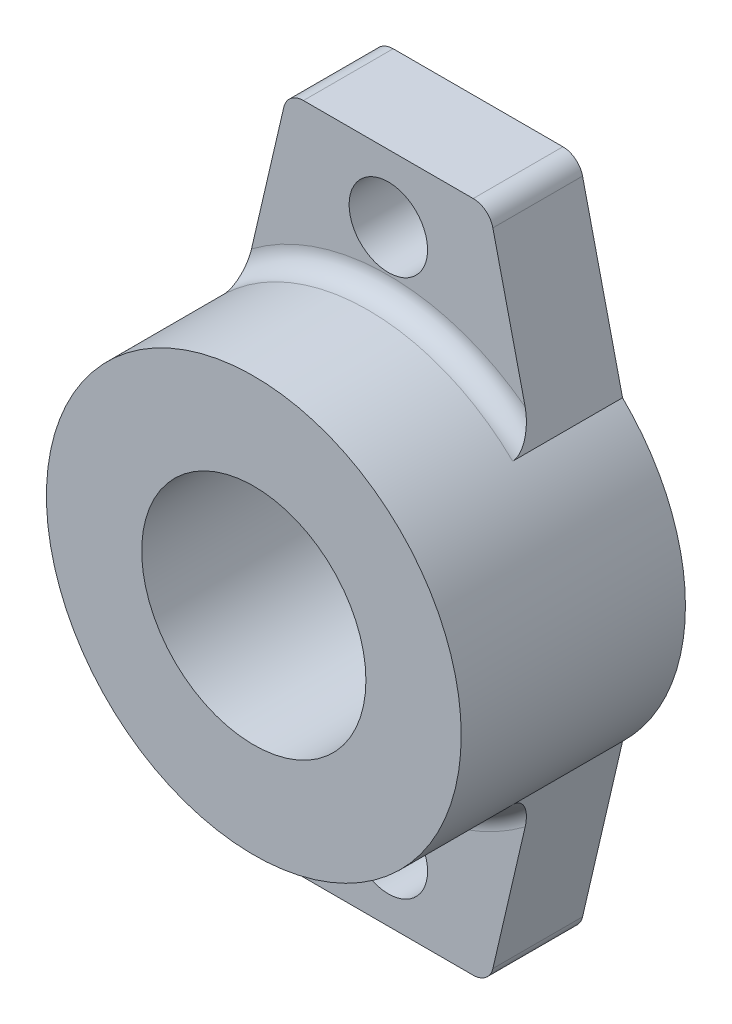
ISO-10303-21;
HEADER;
FILE_DESCRIPTION(('STEP AP214'),'2;1');
FILE_NAME('part.step','',(''),(''),'','','');
FILE_SCHEMA(('AUTOMOTIVE_DESIGN { 1 0 10303 214 1 1 1 1 }'));
ENDSEC;
DATA;
#1=APPLICATION_CONTEXT('core data for automotive mechanical design processes');
#2=APPLICATION_PROTOCOL_DEFINITION('international standard','automotive_design',2000,#1);
#3=PRODUCT_CONTEXT('',#1,'mechanical');
#4=PRODUCT('Part','Part','',(#3));
#5=PRODUCT_RELATED_PRODUCT_CATEGORY('part','',(#4));
#6=PRODUCT_DEFINITION_FORMATION('','',#4);
#7=PRODUCT_DEFINITION_CONTEXT('part definition',#1,'design');
#8=PRODUCT_DEFINITION('design','',#6,#7);
#9=PRODUCT_DEFINITION_SHAPE('','',#8);
#10=(LENGTH_UNIT() NAMED_UNIT(*) SI_UNIT(.MILLI.,.METRE.));
#11=(NAMED_UNIT(*) PLANE_ANGLE_UNIT() SI_UNIT($,.RADIAN.));
#12=(NAMED_UNIT(*) SI_UNIT($,.STERADIAN.) SOLID_ANGLE_UNIT());
#13=UNCERTAINTY_MEASURE_WITH_UNIT(LENGTH_MEASURE(1.E-05),#10,'distance_accuracy_value','');
#14=(GEOMETRIC_REPRESENTATION_CONTEXT(3) GLOBAL_UNCERTAINTY_ASSIGNED_CONTEXT((#13)) GLOBAL_UNIT_ASSIGNED_CONTEXT((#10,
#11,#12)) REPRESENTATION_CONTEXT('',''));
#15=CARTESIAN_POINT('',(0.,0.,0.));
#16=DIRECTION('',(0.,0.,1.));
#17=DIRECTION('',(1.,0.,0.));
#18=AXIS2_PLACEMENT_3D('',#15,#16,#17);
#19=CARTESIAN_POINT('',(0.,0.,1.8));
#20=DIRECTION('',(0.,0.,1.));
#21=DIRECTION('',(-0.00108773057764602,-0.99999940842092,0.));
#22=AXIS2_PLACEMENT_3D('',#19,#20,#21);
#23=TOROIDAL_SURFACE('',#22,20.3,1.8);
#24=CARTESIAN_POINT('',(0.,0.,1.8));
#25=DIRECTION('',(0.,0.,1.));
#26=DIRECTION('',(1.,0.,0.));
#27=AXIS2_PLACEMENT_3D('',#24,#25,#26);
#28=CIRCLE('',#27,18.5);
#29=CARTESIAN_POINT('',(12.8908446844407,13.2693678568961,1.8));
#30=VERTEX_POINT('',#29);
#31=CARTESIAN_POINT('',(-12.8908446844436,13.2693678568933,1.8));
#32=VERTEX_POINT('',#31);
#33=EDGE_CURVE('E258',#30,#32,#28,.T.);
#34=ORIENTED_EDGE('',*,*,#33,.F.);
#35=CARTESIAN_POINT('',(12.2042333189866,16.2217967283392,0.));
#36=CARTESIAN_POINT('',(12.2232682184367,16.139946660704,9.11961296261502E-06));
#37=CARTESIAN_POINT('',(12.2423017843978,16.0581023270711,0.00242689478153281));
#38=CARTESIAN_POINT('',(12.2803269468643,15.8945941284652,0.0119838013190764));
#39=CARTESIAN_POINT('',(12.2993184837802,15.812930519727,0.0191275679718214));
#40=CARTESIAN_POINT('',(12.3371917858918,15.6500753206471,0.0380446501428538));
#41=CARTESIAN_POINT('',(12.3560734937822,15.5688839767184,0.0498201948371002));
#42=CARTESIAN_POINT('',(12.3938557355289,15.4064203372075,0.0781132667526782));
#43=CARTESIAN_POINT('',(12.4127544301867,15.3251559501791,0.0946787495803135));
#44=CARTESIAN_POINT('',(12.4503020778258,15.1637010653311,0.132517470190925));
#45=CARTESIAN_POINT('',(12.4689511136081,15.0835102114672,0.153789103957675));
#46=CARTESIAN_POINT('',(12.5059262640607,14.9245170645208,0.201125705509117));
#47=CARTESIAN_POINT('',(12.5242525261195,14.8457141376679,0.22718841990267));
#48=CARTESIAN_POINT('',(12.5588442801138,14.6969695954925,0.281673166597617));
#49=CARTESIAN_POINT('',(12.5751448334197,14.6268772162773,0.309660748269941));
#50=CARTESIAN_POINT('',(12.6073318632189,14.4884729881406,0.369938382827424));
#51=CARTESIAN_POINT('',(12.6232183964901,14.4201608950743,0.402227842010163));
#52=CARTESIAN_POINT('',(12.654434749978,14.2859305750766,0.471304704683222));
#53=CARTESIAN_POINT('',(12.6697658751882,14.2200067366727,0.508080539327092));
#54=CARTESIAN_POINT('',(12.6997634366419,14.0910172224216,0.586548800367875));
#55=CARTESIAN_POINT('',(12.714430123929,14.0279504670873,0.628239348034514));
#56=CARTESIAN_POINT('',(12.7471293295133,13.8873438830746,0.73016456807406));
#57=CARTESIAN_POINT('',(12.7648732941983,13.8110448349292,0.792235769541915));
#58=CARTESIAN_POINT('',(12.7982676466972,13.667449119184,0.926688539412704));
#59=CARTESIAN_POINT('',(12.8139200264611,13.6001438861991,0.999060160411038));
#60=CARTESIAN_POINT('',(12.8378590450336,13.4972061063374,1.13191597999525));
#61=CARTESIAN_POINT('',(12.8469525795142,13.4581039080711,1.1895461319751));
#62=CARTESIAN_POINT('',(12.862991358577,13.389137158101,1.3102380453768));
#63=CARTESIAN_POINT('',(12.8699453509516,13.35923499089,1.37327630443697));
#64=CARTESIAN_POINT('',(12.8779744475904,13.3247098753434,1.46721917134583));
#65=CARTESIAN_POINT('',(12.8801593650168,13.3153147304099,1.49631780425599));
#66=CARTESIAN_POINT('',(12.8839528936835,13.299002557143,1.55523912964226));
#67=CARTESIAN_POINT('',(12.8855616820268,13.2920847672668,1.58506159659546));
#68=CARTESIAN_POINT('',(12.8881747682006,13.2808484967193,1.64557334191321));
#69=CARTESIAN_POINT('',(12.8891719714603,13.2765605227027,1.67626862453672));
#70=CARTESIAN_POINT('',(12.8905089734045,13.2708114143427,1.73797289475825));
#71=CARTESIAN_POINT('',(12.8908479808622,13.2693536822744,1.76898221493031));
#72=CARTESIAN_POINT('',(12.890844684438,13.2693678568987,1.8));
#73=B_SPLINE_CURVE_WITH_KNOTS('',3,(#35,#36,#37,#38,#39,#40,#41,#42,#43,#44,#45,#46,#47,#48,#49,
#50,#51,#52,#53,#54,#55,#56,#57,#58,#59,#60,#61,#62,#63,#64,#65,#66,#67,#68,#69,#70,#71,#72),
.UNSPECIFIED.,.F.,.F.,(4,2,2,2,2,2,2,2,2,2,2,2,2,2,2,2,2,2,4),(0.,0.252060173238066,
0.504367936020207,0.756797278017636,1.01184698120423,1.26680988833586,1.52165318403949,
1.75316511235686,1.98464512273035,2.21554036441121,2.44634762704796,2.74546529179767,
3.04429602593001,3.25436651161021,3.46356631927681,3.5554403346194,3.64728608345549,
3.74017805742669,3.83318162921873),.UNSPECIFIED.);
#74=CARTESIAN_POINT('',(12.2042333189887,16.2217967283397,0.));
#75=VERTEX_POINT('',#74);
#76=EDGE_CURVE('E292',#75,#30,#73,.T.);
#77=ORIENTED_EDGE('',*,*,#76,.F.);
#78=CARTESIAN_POINT('',(0.,0.,0.));
#79=DIRECTION('',(0.,0.,1.));
#80=DIRECTION('',(0.60119375955621,0.799103287110415,0.));
#81=AXIS2_PLACEMENT_3D('',#78,#79,#80);
#82=CIRCLE('',#81,20.2999999999982);
#83=CARTESIAN_POINT('',(-12.2042333189904,16.2217967283401,0.));
#84=VERTEX_POINT('',#83);
#85=EDGE_CURVE('E176',#84,#75,#82,.F.);
#86=ORIENTED_EDGE('',*,*,#85,.F.);
#87=CARTESIAN_POINT('',(-12.8908446844438,13.269367856893,1.8));
#88=CARTESIAN_POINT('',(-12.8908473650133,13.2693563304442,1.77055724650354));
#89=CARTESIAN_POINT('',(-12.8905421828495,13.2706686137488,1.74112119122909));
#90=CARTESIAN_POINT('',(-12.889336919027,13.2758512481855,1.68251755967709));
#91=CARTESIAN_POINT('',(-12.8884374622074,13.2797189125095,1.65334973399909));
#92=CARTESIAN_POINT('',(-12.8860768062903,13.2898697329531,1.59577756954812));
#93=CARTESIAN_POINT('',(-12.8846215813584,13.2961272001602,1.56736843601897));
#94=CARTESIAN_POINT('',(-12.881184980887,13.3109045821876,1.51117778958981));
#95=CARTESIAN_POINT('',(-12.8792034414771,13.3194252016501,1.48339647509223));
#96=CARTESIAN_POINT('',(-12.8714639649064,13.3527049509041,1.38811186766664));
#97=CARTESIAN_POINT('',(-12.8644508433793,13.3828613734707,1.32254025506602));
#98=CARTESIAN_POINT('',(-12.8481116134284,13.4531200622595,1.197131328713));
#99=CARTESIAN_POINT('',(-12.8387751942596,13.4932666646854,1.13732127174763));
#100=CARTESIAN_POINT('',(-12.812967309783,13.6042405679347,0.993303673886252));
#101=CARTESIAN_POINT('',(-12.7953486251054,13.6800009120485,0.913130856053849));
#102=CARTESIAN_POINT('',(-12.7576108952042,13.8422731506236,0.765376808899514));
#103=CARTESIAN_POINT('',(-12.7374867751858,13.9288068667027,0.697821852184106));
#104=CARTESIAN_POINT('',(-12.6987803539259,14.0952444781203,0.583143803727191));
#105=CARTESIAN_POINT('',(-12.6804289158382,14.1741556618973,0.534475864697016));
#106=CARTESIAN_POINT('',(-12.6428439990388,14.3357708041346,0.444223427244978));
#107=CARTESIAN_POINT('',(-12.6236099361613,14.4184772745077,0.40264370855227));
#108=CARTESIAN_POINT('',(-12.5844460800716,14.5868818556937,0.325945108489204));
#109=CARTESIAN_POINT('',(-12.5645148501995,14.6725861441438,0.290840632922034));
#110=CARTESIAN_POINT('',(-12.5241485316273,14.8461613140038,0.226810517380867));
#111=CARTESIAN_POINT('',(-12.503713355718,14.934032570414,0.197885955348159));
#112=CARTESIAN_POINT('',(-12.4603419406794,15.12052965508,0.143316985256996));
#113=CARTESIAN_POINT('',(-12.4373643079811,15.2193334756827,0.118314143533851));
#114=CARTESIAN_POINT('',(-12.3910707178822,15.4183959131079,0.0753907168346387));
#115=CARTESIAN_POINT('',(-12.36775472009,15.5186547036144,0.0574709847203253));
#116=CARTESIAN_POINT('',(-12.3211231318946,15.7191705328546,0.0288547973592498));
#117=CARTESIAN_POINT('',(-12.2978096678294,15.8194184283348,0.0180909361538147));
#118=CARTESIAN_POINT('',(-12.2510760833725,16.0203728414994,0.00367492853575505));
#119=CARTESIAN_POINT('',(-12.2276559896016,16.1210792447145,2.10952171475398E-05));
#120=CARTESIAN_POINT('',(-12.2042333189909,16.2217967283402,0.));
#121=B_SPLINE_CURVE_WITH_KNOTS('',3,(#87,#88,#89,#90,#91,#92,#93,#94,#95,#96,#97,#98,#99,#100,
#101,#102,#103,#104,#105,#106,#107,#108,#109,#110,#111,#112,#113,#114,#115,#116,#117,#118,#119,
#120),.UNSPECIFIED.,.F.,.F.,(4,2,2,2,2,2,2,2,2,2,2,2,2,2,2,2,4),(0.,0.0882865522680601,
0.176480424688227,0.263751799769501,0.351050379086609,0.567279268013555,0.784485446651958,
1.11772253115301,1.45164592191043,1.73479311793806,2.01813049696852,2.30209082226262,
2.58610063742702,2.89926651766176,3.21247009403775,3.52267993671267,3.83281617086143),.UNSPECIFIED.);
#122=EDGE_CURVE('E276',#32,#84,#121,.T.);
#123=ORIENTED_EDGE('',*,*,#122,.F.);
#124=EDGE_LOOP('',(#34,#77,#86,#123));
#125=FACE_BOUND('',#124,.T.);
#126=ADVANCED_FACE('F17',(#125),#23,.F.);
#127=CARTESIAN_POINT('',(0.,0.,1.8));
#128=DIRECTION('',(0.,0.,1.));
#129=DIRECTION('',(0.00108773057764602,0.99999940842092,0.));
#130=AXIS2_PLACEMENT_3D('',#127,#128,#129);
#131=TOROIDAL_SURFACE('',#130,20.3,1.8);
#132=CARTESIAN_POINT('',(0.,0.,1.8));
#133=DIRECTION('',(0.,0.,1.));
#134=DIRECTION('',(1.,0.,0.));
#135=AXIS2_PLACEMENT_3D('',#132,#133,#134);
#136=CIRCLE('',#135,18.5);
#137=CARTESIAN_POINT('',(-12.890844684439,-13.2693678568944,1.8));
#138=VERTEX_POINT('',#137);
#139=CARTESIAN_POINT('',(12.8908446844441,-13.269367856892,1.8));
#140=VERTEX_POINT('',#139);
#141=EDGE_CURVE('E168',#138,#140,#136,.T.);
#142=ORIENTED_EDGE('',*,*,#141,.F.);
#143=CARTESIAN_POINT('',(-12.2042333189866,-16.2217967283392,0.));
#144=CARTESIAN_POINT('',(-12.2232682184367,-16.139946660704,9.11961296261502E-06));
#145=CARTESIAN_POINT('',(-12.2423017843978,-16.0581023270711,0.00242689478153281));
#146=CARTESIAN_POINT('',(-12.2803269468643,-15.8945941284652,0.0119838013190764));
#147=CARTESIAN_POINT('',(-12.2993184837802,-15.812930519727,0.0191275679718214));
#148=CARTESIAN_POINT('',(-12.3371917858918,-15.6500753206471,0.0380446501428538));
#149=CARTESIAN_POINT('',(-12.3560734937822,-15.5688839767184,0.0498201948371002));
#150=CARTESIAN_POINT('',(-12.3938557355289,-15.4064203372075,0.0781132667526782));
#151=CARTESIAN_POINT('',(-12.4127544301867,-15.3251559501791,0.0946787495803135));
#152=CARTESIAN_POINT('',(-12.4503020778258,-15.1637010653311,0.132517470190925));
#153=CARTESIAN_POINT('',(-12.4689511136081,-15.0835102114672,0.153789103957675));
#154=CARTESIAN_POINT('',(-12.5059262640607,-14.9245170645208,0.201125705509117));
#155=CARTESIAN_POINT('',(-12.5242525261195,-14.8457141376679,0.22718841990267));
#156=CARTESIAN_POINT('',(-12.5588442801138,-14.6969695954925,0.281673166597617));
#157=CARTESIAN_POINT('',(-12.5751448334197,-14.6268772162773,0.309660748269941));
#158=CARTESIAN_POINT('',(-12.6073318632189,-14.4884729881406,0.369938382827424));
#159=CARTESIAN_POINT('',(-12.6232183964901,-14.4201608950743,0.402227842010163));
#160=CARTESIAN_POINT('',(-12.654434749978,-14.2859305750766,0.471304704683222));
#161=CARTESIAN_POINT('',(-12.6697658751882,-14.2200067366727,0.508080539327092));
#162=CARTESIAN_POINT('',(-12.6997634366419,-14.0910172224216,0.586548800367875));
#163=CARTESIAN_POINT('',(-12.714430123929,-14.0279504670873,0.628239348034514));
#164=CARTESIAN_POINT('',(-12.7471293295133,-13.8873438830746,0.73016456807406));
#165=CARTESIAN_POINT('',(-12.7648732941983,-13.8110448349292,0.792235769541915));
#166=CARTESIAN_POINT('',(-12.7982676466972,-13.667449119184,0.926688539412704));
#167=CARTESIAN_POINT('',(-12.8139200264611,-13.6001438861991,0.999060160411038));
#168=CARTESIAN_POINT('',(-12.8378590450336,-13.4972061063374,1.13191597999525));
#169=CARTESIAN_POINT('',(-12.8469525795142,-13.4581039080711,1.1895461319751));
#170=CARTESIAN_POINT('',(-12.862991358577,-13.389137158101,1.3102380453768));
#171=CARTESIAN_POINT('',(-12.8699453509516,-13.35923499089,1.37327630443697));
#172=CARTESIAN_POINT('',(-12.8779744475904,-13.3247098753434,1.46721917134583));
#173=CARTESIAN_POINT('',(-12.8801593650168,-13.3153147304099,1.49631780425599));
#174=CARTESIAN_POINT('',(-12.8839528936835,-13.299002557143,1.55523912964226));
#175=CARTESIAN_POINT('',(-12.8855616820268,-13.2920847672668,1.58506159659546));
#176=CARTESIAN_POINT('',(-12.8881747682006,-13.2808484967193,1.64557334191321));
#177=CARTESIAN_POINT('',(-12.8891719714603,-13.2765605227027,1.67626862453672));
#178=CARTESIAN_POINT('',(-12.8905089734045,-13.2708114143427,1.73797289475825));
#179=CARTESIAN_POINT('',(-12.8908479808622,-13.2693536822744,1.76898221493031));
#180=CARTESIAN_POINT('',(-12.890844684438,-13.2693678568987,1.8));
#181=B_SPLINE_CURVE_WITH_KNOTS('',3,(#143,#144,#145,#146,#147,#148,#149,#150,#151,#152,#153,
#154,#155,#156,#157,#158,#159,#160,#161,#162,#163,#164,#165,#166,#167,#168,#169,#170,#171,#172,
#173,#174,#175,#176,#177,#178,#179,#180),.UNSPECIFIED.,.F.,.F.,(4,2,2,2,2,2,2,2,2,2,2,2,2,2,2,2,
2,2,4),(0.,0.252060173238066,0.504367936020207,0.756797278017636,1.01184698120423,
1.26680988833586,1.52165318403949,1.75316511235686,1.98464512273035,2.21554036441121,
2.44634762704796,2.74546529179767,3.04429602593001,3.25436651161021,3.46356631927681,
3.5554403346194,3.64728608345549,3.74017805742669,3.83318162921873),.UNSPECIFIED.);
#182=CARTESIAN_POINT('',(-12.2042333189887,-16.2217967283397,0.));
#183=VERTEX_POINT('',#182);
#184=EDGE_CURVE('E254',#183,#138,#181,.T.);
#185=ORIENTED_EDGE('',*,*,#184,.F.);
#186=CARTESIAN_POINT('',(0.,0.,0.));
#187=DIRECTION('',(0.,0.,1.));
#188=DIRECTION('',(-0.60119375955621,-0.799103287110415,0.));
#189=AXIS2_PLACEMENT_3D('',#186,#187,#188);
#190=CIRCLE('',#189,20.2999999999982);
#191=CARTESIAN_POINT('',(12.2042333189904,-16.2217967283401,0.));
#192=VERTEX_POINT('',#191);
#193=EDGE_CURVE('E130',#192,#183,#190,.F.);
#194=ORIENTED_EDGE('',*,*,#193,.F.);
#195=CARTESIAN_POINT('',(12.8908446844438,-13.269367856893,1.8));
#196=CARTESIAN_POINT('',(12.8908473650133,-13.2693563304442,1.77055724650354));
#197=CARTESIAN_POINT('',(12.8905421828495,-13.2706686137488,1.74112119122909));
#198=CARTESIAN_POINT('',(12.889336919027,-13.2758512481855,1.68251755967709));
#199=CARTESIAN_POINT('',(12.8884374622074,-13.2797189125095,1.65334973399909));
#200=CARTESIAN_POINT('',(12.8860768062903,-13.2898697329531,1.59577756954812));
#201=CARTESIAN_POINT('',(12.8846215813584,-13.2961272001602,1.56736843601897));
#202=CARTESIAN_POINT('',(12.881184980887,-13.3109045821876,1.51117778958981));
#203=CARTESIAN_POINT('',(12.8792034414771,-13.3194252016501,1.48339647509223));
#204=CARTESIAN_POINT('',(12.8714639649064,-13.3527049509041,1.38811186766664));
#205=CARTESIAN_POINT('',(12.8644508433793,-13.3828613734707,1.32254025506602));
#206=CARTESIAN_POINT('',(12.8481116134284,-13.4531200622595,1.197131328713));
#207=CARTESIAN_POINT('',(12.8387751942596,-13.4932666646854,1.13732127174763));
#208=CARTESIAN_POINT('',(12.812967309783,-13.6042405679347,0.993303673886252));
#209=CARTESIAN_POINT('',(12.7953486251054,-13.6800009120485,0.913130856053849));
#210=CARTESIAN_POINT('',(12.7576108952042,-13.8422731506236,0.765376808899514));
#211=CARTESIAN_POINT('',(12.7374867751858,-13.9288068667027,0.697821852184106));
#212=CARTESIAN_POINT('',(12.6987803539259,-14.0952444781203,0.583143803727191));
#213=CARTESIAN_POINT('',(12.6804289158382,-14.1741556618973,0.534475864697016));
#214=CARTESIAN_POINT('',(12.6428439990388,-14.3357708041346,0.444223427244978));
#215=CARTESIAN_POINT('',(12.6236099361613,-14.4184772745077,0.40264370855227));
#216=CARTESIAN_POINT('',(12.5844460800716,-14.5868818556937,0.325945108489204));
#217=CARTESIAN_POINT('',(12.5645148501995,-14.6725861441438,0.290840632922034));
#218=CARTESIAN_POINT('',(12.5241485316273,-14.8461613140038,0.226810517380867));
#219=CARTESIAN_POINT('',(12.503713355718,-14.934032570414,0.197885955348159));
#220=CARTESIAN_POINT('',(12.4603419406794,-15.12052965508,0.143316985256996));
#221=CARTESIAN_POINT('',(12.4373643079811,-15.2193334756827,0.118314143533851));
#222=CARTESIAN_POINT('',(12.3910707178822,-15.4183959131079,0.0753907168346387));
#223=CARTESIAN_POINT('',(12.36775472009,-15.5186547036144,0.0574709847203253));
#224=CARTESIAN_POINT('',(12.3211231318946,-15.7191705328546,0.0288547973592498));
#225=CARTESIAN_POINT('',(12.2978096678294,-15.8194184283348,0.0180909361538147));
#226=CARTESIAN_POINT('',(12.2510760833725,-16.0203728414994,0.00367492853575505));
#227=CARTESIAN_POINT('',(12.2276559896016,-16.1210792447145,2.10952171475398E-05));
#228=CARTESIAN_POINT('',(12.2042333189909,-16.2217967283402,0.));
#229=B_SPLINE_CURVE_WITH_KNOTS('',3,(#195,#196,#197,#198,#199,#200,#201,#202,#203,#204,#205,
#206,#207,#208,#209,#210,#211,#212,#213,#214,#215,#216,#217,#218,#219,#220,#221,#222,#223,#224,
#225,#226,#227,#228),.UNSPECIFIED.,.F.,.F.,(4,2,2,2,2,2,2,2,2,2,2,2,2,2,2,2,4),(0.,
0.0882865522680601,0.176480424688227,0.263751799769501,0.351050379086609,0.567279268013555,
0.784485446651958,1.11772253115301,1.45164592191043,1.73479311793806,2.01813049696852,
2.30209082226262,2.58610063742702,2.89926651766176,3.21247009403775,3.52267993671267,
3.83281617086143),.UNSPECIFIED.);
#230=EDGE_CURVE('E304',#140,#192,#229,.T.);
#231=ORIENTED_EDGE('',*,*,#230,.F.);
#232=EDGE_LOOP('',(#142,#185,#194,#231));
#233=FACE_BOUND('',#232,.T.);
#234=ADVANCED_FACE('F180',(#233),#131,.F.);
#235=CARTESIAN_POINT('',(0.,0.,12.));
#236=DIRECTION('',(0.,0.,1.));
#237=DIRECTION('',(1.,0.,0.));
#238=AXIS2_PLACEMENT_3D('',#235,#236,#237);
#239=PLANE('',#238);
#240=CARTESIAN_POINT('',(0.,0.,12.));
#241=DIRECTION('',(0.,0.,1.));
#242=DIRECTION('',(1.,0.,0.));
#243=AXIS2_PLACEMENT_3D('',#240,#241,#242);
#244=CIRCLE('',#243,10.);
#245=CARTESIAN_POINT('',(10.,0.,12.));
#246=VERTEX_POINT('',#245);
#247=EDGE_CURVE('E251',#246,#246,#244,.F.);
#248=ORIENTED_EDGE('',*,*,#247,.T.);
#249=EDGE_LOOP('',(#248));
#250=FACE_BOUND('',#249,.T.);
#251=CARTESIAN_POINT('',(0.,0.,12.));
#252=DIRECTION('',(0.,0.,1.));
#253=DIRECTION('',(1.,0.,0.));
#254=AXIS2_PLACEMENT_3D('',#251,#252,#253);
#255=CIRCLE('',#254,18.5);
#256=CARTESIAN_POINT('',(18.5,0.,12.));
#257=VERTEX_POINT('',#256);
#258=EDGE_CURVE('E272',#257,#257,#255,.F.);
#259=ORIENTED_EDGE('',*,*,#258,.F.);
#260=EDGE_LOOP('',(#259));
#261=FACE_BOUND('',#260,.T.);
#262=ADVANCED_FACE('F163',(#250,#261),#239,.T.);
#263=CARTESIAN_POINT('',(0.,0.,0.));
#264=DIRECTION('',(0.,0.,1.));
#265=DIRECTION('',(1.,0.,0.));
#266=AXIS2_PLACEMENT_3D('',#263,#264,#265);
#267=PLANE('',#266);
#268=CARTESIAN_POINT('',(0.,24.,0.));
#269=DIRECTION('',(0.,0.,-1.));
#270=DIRECTION('',(-1.,0.,0.));
#271=AXIS2_PLACEMENT_3D('',#268,#269,#270);
#272=CIRCLE('',#271,3.5);
#273=CARTESIAN_POINT('',(-3.5,24.,0.));
#274=VERTEX_POINT('',#273);
#275=EDGE_CURVE('E248',#274,#274,#272,.T.);
#276=ORIENTED_EDGE('',*,*,#275,.T.);
#277=EDGE_LOOP('',(#276));
#278=FACE_BOUND('',#277,.T.);
#279=DIRECTION('',(1.,0.,0.));
#280=VECTOR('',#279,1.);
#281=CARTESIAN_POINT('',(9.,30.,0.));
#282=LINE('',#281,#280);
#283=CARTESIAN_POINT('',(-7.570570600076,30.,0.));
#284=VERTEX_POINT('',#283);
#285=CARTESIAN_POINT('',(7.570570600076,30.,0.));
#286=VERTEX_POINT('',#285);
#287=EDGE_CURVE('E285',#284,#286,#282,.T.);
#288=ORIENTED_EDGE('',*,*,#287,.F.);
#289=CARTESIAN_POINT('',(-7.570570600076,28.2,0.));
#290=DIRECTION('',(0.,0.,-1.));
#291=DIRECTION('',(-1.,0.,0.));
#292=AXIS2_PLACEMENT_3D('',#289,#290,#291);
#293=CIRCLE('',#292,1.8);
#294=CARTESIAN_POINT('',(-9.32378504874672,28.6077242903893,0.));
#295=VERTEX_POINT('',#294);
#296=EDGE_CURVE('E282',#295,#284,#293,.T.);
#297=ORIENTED_EDGE('',*,*,#296,.F.);
#298=DIRECTION('',(-0.226513494660298,-0.974008027039192,0.));
#299=VECTOR('',#298,1.);
#300=CARTESIAN_POINT('',(-9.,30.,0.));
#301=LINE('',#300,#299);
#302=EDGE_CURVE('E274',#84,#295,#301,.F.);
#303=ORIENTED_EDGE('',*,*,#302,.F.);
#304=ORIENTED_EDGE('',*,*,#85,.T.);
#305=DIRECTION('',(-0.226513494660298,0.974008027039192,0.));
#306=VECTOR('',#305,1.);
#307=CARTESIAN_POINT('',(12.89084468444,13.26936785689,0.));
#308=LINE('',#307,#306);
#309=CARTESIAN_POINT('',(9.3237850487444,28.6077242903887,0.));
#310=VERTEX_POINT('',#309);
#311=EDGE_CURVE('E289',#310,#75,#308,.F.);
#312=ORIENTED_EDGE('',*,*,#311,.F.);
#313=CARTESIAN_POINT('',(7.570570600076,28.2,0.));
#314=DIRECTION('',(0.,0.,-1.));
#315=DIRECTION('',(-1.,0.,0.));
#316=AXIS2_PLACEMENT_3D('',#313,#314,#315);
#317=CIRCLE('',#316,1.8);
#318=EDGE_CURVE('E288',#286,#310,#317,.T.);
#319=ORIENTED_EDGE('',*,*,#318,.F.);
#320=EDGE_LOOP('',(#288,#297,#303,#304,#312,#319));
#321=FACE_BOUND('',#320,.T.);
#322=ADVANCED_FACE('F157',(#278,#321),#267,.T.);
#323=CARTESIAN_POINT('',(0.,0.,0.));
#324=DIRECTION('',(0.,0.,1.));
#325=DIRECTION('',(1.,0.,0.));
#326=AXIS2_PLACEMENT_3D('',#323,#324,#325);
#327=PLANE('',#326);
#328=CARTESIAN_POINT('',(0.,-24.,0.));
#329=DIRECTION('',(0.,0.,1.));
#330=DIRECTION('',(1.,0.,0.));
#331=AXIS2_PLACEMENT_3D('',#328,#329,#330);
#332=CIRCLE('',#331,3.5);
#333=CARTESIAN_POINT('',(3.5,-24.,0.));
#334=VERTEX_POINT('',#333);
#335=EDGE_CURVE('E245',#334,#334,#332,.F.);
#336=ORIENTED_EDGE('',*,*,#335,.T.);
#337=EDGE_LOOP('',(#336));
#338=FACE_BOUND('',#337,.T.);
#339=DIRECTION('',(0.226513494660298,-0.974008027039192,0.));
#340=VECTOR('',#339,1.);
#341=CARTESIAN_POINT('',(-12.89084468444,-13.26936785689,0.));
#342=LINE('',#341,#340);
#343=CARTESIAN_POINT('',(-9.3237850487424,-28.6077242903883,0.));
#344=VERTEX_POINT('',#343);
#345=EDGE_CURVE('E126',#344,#183,#342,.F.);
#346=ORIENTED_EDGE('',*,*,#345,.F.);
#347=CARTESIAN_POINT('',(-7.570570600076,-28.2,0.));
#348=DIRECTION('',(0.,0.,-1.));
#349=DIRECTION('',(-1.,0.,0.));
#350=AXIS2_PLACEMENT_3D('',#347,#348,#349);
#351=CIRCLE('',#350,1.8);
#352=CARTESIAN_POINT('',(-7.570570600076,-30.,0.));
#353=VERTEX_POINT('',#352);
#354=EDGE_CURVE('E22',#353,#344,#351,.T.);
#355=ORIENTED_EDGE('',*,*,#354,.F.);
#356=DIRECTION('',(1.,0.,0.));
#357=VECTOR('',#356,1.);
#358=CARTESIAN_POINT('',(-9.,-30.,0.));
#359=LINE('',#358,#357);
#360=CARTESIAN_POINT('',(7.570570600076,-30.,0.));
#361=VERTEX_POINT('',#360);
#362=EDGE_CURVE('E110',#361,#353,#359,.F.);
#363=ORIENTED_EDGE('',*,*,#362,.F.);
#364=CARTESIAN_POINT('',(7.570570600076,-28.2,0.));
#365=DIRECTION('',(0.,0.,-1.));
#366=DIRECTION('',(-1.,0.,0.));
#367=AXIS2_PLACEMENT_3D('',#364,#365,#366);
#368=CIRCLE('',#367,1.8);
#369=CARTESIAN_POINT('',(9.32378504874672,-28.6077242903893,0.));
#370=VERTEX_POINT('',#369);
#371=EDGE_CURVE('E134',#370,#361,#368,.T.);
#372=ORIENTED_EDGE('',*,*,#371,.F.);
#373=DIRECTION('',(0.226513494660298,0.974008027039192,0.));
#374=VECTOR('',#373,1.);
#375=CARTESIAN_POINT('',(9.,-30.,0.));
#376=LINE('',#375,#374);
#377=EDGE_CURVE('E302',#192,#370,#376,.F.);
#378=ORIENTED_EDGE('',*,*,#377,.F.);
#379=ORIENTED_EDGE('',*,*,#193,.T.);
#380=EDGE_LOOP('',(#346,#355,#363,#372,#378,#379));
#381=FACE_BOUND('',#380,.T.);
#382=ADVANCED_FACE('F123',(#338,#381),#327,.T.);
#383=CARTESIAN_POINT('',(-7.570570600076,-28.2,38.072));
#384=DIRECTION('',(0.,0.,-1.));
#385=DIRECTION('',(-1.,0.,0.));
#386=AXIS2_PLACEMENT_3D('',#383,#384,#385);
#387=CYLINDRICAL_SURFACE('',#386,1.8);
#388=DIRECTION('',(0.,0.,1.));
#389=VECTOR('',#388,1.);
#390=CARTESIAN_POINT('',(-9.32378504874225,-28.6077242903889,0.));
#391=LINE('',#390,#389);
#392=CARTESIAN_POINT('',(-9.32378504874484,-28.6077242903885,-8.));
#393=VERTEX_POINT('',#392);
#394=EDGE_CURVE('E253',#393,#344,#391,.T.);
#395=ORIENTED_EDGE('',*,*,#394,.F.);
#396=CARTESIAN_POINT('',(-7.570570600076,-28.2,-8.));
#397=DIRECTION('',(0.,0.,-1.));
#398=DIRECTION('',(-1.,0.,0.));
#399=AXIS2_PLACEMENT_3D('',#396,#397,#398);
#400=CIRCLE('',#399,1.8);
#401=CARTESIAN_POINT('',(-7.570570600076,-30.,-8.));
#402=VERTEX_POINT('',#401);
#403=EDGE_CURVE('E133',#393,#402,#400,.F.);
#404=ORIENTED_EDGE('',*,*,#403,.T.);
#405=DIRECTION('',(0.,0.,-1.));
#406=VECTOR('',#405,1.);
#407=CARTESIAN_POINT('',(-7.570570600076,-30.,0.));
#408=LINE('',#407,#406);
#409=EDGE_CURVE('E115',#353,#402,#408,.T.);
#410=ORIENTED_EDGE('',*,*,#409,.F.);
#411=ORIENTED_EDGE('',*,*,#354,.T.);
#412=EDGE_LOOP('',(#395,#404,#410,#411));
#413=FACE_BOUND('',#412,.T.);
#414=ADVANCED_FACE('F132',(#413),#387,.T.);
#415=CARTESIAN_POINT('',(-9.,-30.,0.));
#416=DIRECTION('',(0.,-1.,0.));
#417=DIRECTION('',(0.,0.,-1.));
#418=AXIS2_PLACEMENT_3D('',#415,#416,#417);
#419=PLANE('',#418);
#420=ORIENTED_EDGE('',*,*,#362,.T.);
#421=ORIENTED_EDGE('',*,*,#409,.T.);
#422=DIRECTION('',(1.,0.,0.));
#423=VECTOR('',#422,1.);
#424=CARTESIAN_POINT('',(0.,-30.,-8.));
#425=LINE('',#424,#423);
#426=CARTESIAN_POINT('',(7.570570600076,-30.,-8.));
#427=VERTEX_POINT('',#426);
#428=EDGE_CURVE('E243',#402,#427,#425,.T.);
#429=ORIENTED_EDGE('',*,*,#428,.T.);
#430=DIRECTION('',(0.,0.,-1.));
#431=VECTOR('',#430,1.);
#432=CARTESIAN_POINT('',(7.570570600076,-30.,38.072));
#433=LINE('',#432,#431);
#434=EDGE_CURVE('E117',#361,#427,#433,.T.);
#435=ORIENTED_EDGE('',*,*,#434,.F.);
#436=EDGE_LOOP('',(#420,#421,#429,#435));
#437=FACE_BOUND('',#436,.T.);
#438=ADVANCED_FACE('F112',(#437),#419,.T.);
#439=CARTESIAN_POINT('',(7.570570600076,-28.2,38.072));
#440=DIRECTION('',(0.,0.,-1.));
#441=DIRECTION('',(-1.,0.,0.));
#442=AXIS2_PLACEMENT_3D('',#439,#440,#441);
#443=CYLINDRICAL_SURFACE('',#442,1.8);
#444=ORIENTED_EDGE('',*,*,#434,.T.);
#445=CARTESIAN_POINT('',(7.570570600076,-28.2,-8.));
#446=DIRECTION('',(0.,0.,-1.));
#447=DIRECTION('',(-1.,0.,0.));
#448=AXIS2_PLACEMENT_3D('',#445,#446,#447);
#449=CIRCLE('',#448,1.8);
#450=CARTESIAN_POINT('',(9.323785048747,-28.607724290389,-8.));
#451=VERTEX_POINT('',#450);
#452=EDGE_CURVE('E240',#427,#451,#449,.F.);
#453=ORIENTED_EDGE('',*,*,#452,.T.);
#454=DIRECTION('',(0.,0.,1.));
#455=VECTOR('',#454,1.);
#456=CARTESIAN_POINT('',(9.32378504874656,-28.6077242903899,0.));
#457=LINE('',#456,#455);
#458=EDGE_CURVE('E293',#370,#451,#457,.F.);
#459=ORIENTED_EDGE('',*,*,#458,.F.);
#460=ORIENTED_EDGE('',*,*,#371,.T.);
#461=EDGE_LOOP('',(#444,#453,#459,#460));
#462=FACE_BOUND('',#461,.T.);
#463=ADVANCED_FACE('F319',(#462),#443,.T.);
#464=CARTESIAN_POINT('',(9.,-30.,0.));
#465=DIRECTION('',(0.974008027039192,-0.226513494660298,0.));
#466=DIRECTION('',(0.226513494660298,0.974008027039192,0.));
#467=AXIS2_PLACEMENT_3D('',#464,#465,#466);
#468=PLANE('',#467);
#469=ORIENTED_EDGE('',*,*,#377,.T.);
#470=ORIENTED_EDGE('',*,*,#458,.T.);
#471=DIRECTION('',(0.226513494659997,0.974008027039262,0.));
#472=VECTOR('',#471,1.);
#473=CARTESIAN_POINT('',(9.323785048747,-28.60772429039,-8.));
#474=LINE('',#473,#472);
#475=CARTESIAN_POINT('',(12.8908446844407,-13.2693678568961,-8.));
#476=VERTEX_POINT('',#475);
#477=EDGE_CURVE('E239',#451,#476,#474,.T.);
#478=ORIENTED_EDGE('',*,*,#477,.T.);
#479=DIRECTION('',(0.,0.,1.));
#480=VECTOR('',#479,1.);
#481=CARTESIAN_POINT('',(12.8908446844434,-13.2693678568935,0.));
#482=LINE('',#481,#480);
#483=EDGE_CURVE('E296',#140,#476,#482,.F.);
#484=ORIENTED_EDGE('',*,*,#483,.F.);
#485=ORIENTED_EDGE('',*,*,#230,.T.);
#486=EDGE_LOOP('',(#469,#470,#478,#484,#485));
#487=FACE_BOUND('',#486,.T.);
#488=ADVANCED_FACE('F310',(#487),#468,.T.);
#489=CARTESIAN_POINT('',(12.89084468444,13.26936785689,0.));
#490=DIRECTION('',(0.974008027039192,0.226513494660298,0.));
#491=DIRECTION('',(-0.226513494660298,0.974008027039192,0.));
#492=AXIS2_PLACEMENT_3D('',#489,#490,#491);
#493=PLANE('',#492);
#494=DIRECTION('',(-0.226513494659997,0.974008027039262,0.));
#495=VECTOR('',#494,1.);
#496=CARTESIAN_POINT('',(12.89084468444,13.26936785689,-8.));
#497=LINE('',#496,#495);
#498=CARTESIAN_POINT('',(12.8908446844407,13.2693678568961,-8.));
#499=VERTEX_POINT('',#498);
#500=CARTESIAN_POINT('',(9.32378504874684,28.607724290389,-8.));
#501=VERTEX_POINT('',#500);
#502=EDGE_CURVE('E235',#499,#501,#497,.T.);
#503=ORIENTED_EDGE('',*,*,#502,.T.);
#504=DIRECTION('',(0.,0.,-1.));
#505=VECTOR('',#504,1.);
#506=CARTESIAN_POINT('',(9.32378504874625,28.6077242903898,38.072));
#507=LINE('',#506,#505);
#508=EDGE_CURVE('E286',#310,#501,#507,.T.);
#509=ORIENTED_EDGE('',*,*,#508,.F.);
#510=ORIENTED_EDGE('',*,*,#311,.T.);
#511=ORIENTED_EDGE('',*,*,#76,.T.);
#512=DIRECTION('',(0.,0.,1.));
#513=VECTOR('',#512,1.);
#514=CARTESIAN_POINT('',(12.8908446844434,13.2693678568935,0.));
#515=LINE('',#514,#513);
#516=EDGE_CURVE('E261',#499,#30,#515,.T.);
#517=ORIENTED_EDGE('',*,*,#516,.F.);
#518=EDGE_LOOP('',(#503,#509,#510,#511,#517));
#519=FACE_BOUND('',#518,.T.);
#520=ADVANCED_FACE('F337',(#519),#493,.T.);
#521=CARTESIAN_POINT('',(7.570570600076,28.2,38.072));
#522=DIRECTION('',(0.,0.,-1.));
#523=DIRECTION('',(-1.,0.,0.));
#524=AXIS2_PLACEMENT_3D('',#521,#522,#523);
#525=CYLINDRICAL_SURFACE('',#524,1.8);
#526=ORIENTED_EDGE('',*,*,#508,.T.);
#527=CARTESIAN_POINT('',(7.570570600076,28.2,-8.));
#528=DIRECTION('',(0.,0.,-1.));
#529=DIRECTION('',(-1.,0.,0.));
#530=AXIS2_PLACEMENT_3D('',#527,#528,#529);
#531=CIRCLE('',#530,1.8);
#532=CARTESIAN_POINT('',(7.570570600076,30.,-8.));
#533=VERTEX_POINT('',#532);
#534=EDGE_CURVE('E232',#501,#533,#531,.F.);
#535=ORIENTED_EDGE('',*,*,#534,.T.);
#536=DIRECTION('',(0.,0.,1.));
#537=VECTOR('',#536,1.);
#538=CARTESIAN_POINT('',(7.570570600076,30.,0.));
#539=LINE('',#538,#537);
#540=EDGE_CURVE('E283',#286,#533,#539,.F.);
#541=ORIENTED_EDGE('',*,*,#540,.F.);
#542=ORIENTED_EDGE('',*,*,#318,.T.);
#543=EDGE_LOOP('',(#526,#535,#541,#542));
#544=FACE_BOUND('',#543,.T.);
#545=ADVANCED_FACE('F418',(#544),#525,.T.);
#546=CARTESIAN_POINT('',(9.,30.,0.));
#547=DIRECTION('',(0.,1.,0.));
#548=DIRECTION('',(0.,0.,1.));
#549=AXIS2_PLACEMENT_3D('',#546,#547,#548);
#550=PLANE('',#549);
#551=DIRECTION('',(1.,0.,0.));
#552=VECTOR('',#551,1.);
#553=CARTESIAN_POINT('',(0.,30.,-8.));
#554=LINE('',#553,#552);
#555=CARTESIAN_POINT('',(-7.570570600076,30.,-8.));
#556=VERTEX_POINT('',#555);
#557=EDGE_CURVE('E231',#533,#556,#554,.F.);
#558=ORIENTED_EDGE('',*,*,#557,.T.);
#559=DIRECTION('',(0.,0.,-1.));
#560=VECTOR('',#559,1.);
#561=CARTESIAN_POINT('',(-7.570570600076,30.,38.072));
#562=LINE('',#561,#560);
#563=EDGE_CURVE('E280',#284,#556,#562,.T.);
#564=ORIENTED_EDGE('',*,*,#563,.F.);
#565=ORIENTED_EDGE('',*,*,#287,.T.);
#566=ORIENTED_EDGE('',*,*,#540,.T.);
#567=EDGE_LOOP('',(#558,#564,#565,#566));
#568=FACE_BOUND('',#567,.T.);
#569=ADVANCED_FACE('F420',(#568),#550,.T.);
#570=CARTESIAN_POINT('',(-7.570570600076,28.2,38.072));
#571=DIRECTION('',(0.,0.,-1.));
#572=DIRECTION('',(-1.,0.,0.));
#573=AXIS2_PLACEMENT_3D('',#570,#571,#572);
#574=CYLINDRICAL_SURFACE('',#573,1.8);
#575=ORIENTED_EDGE('',*,*,#563,.T.);
#576=CARTESIAN_POINT('',(-7.570570600076,28.2,-8.));
#577=DIRECTION('',(0.,0.,-1.));
#578=DIRECTION('',(-1.,0.,0.));
#579=AXIS2_PLACEMENT_3D('',#576,#577,#578);
#580=CIRCLE('',#579,1.8);
#581=CARTESIAN_POINT('',(-9.323785048747,28.607724290389,-8.));
#582=VERTEX_POINT('',#581);
#583=EDGE_CURVE('E228',#556,#582,#580,.F.);
#584=ORIENTED_EDGE('',*,*,#583,.T.);
#585=DIRECTION('',(0.,0.,1.));
#586=VECTOR('',#585,1.);
#587=CARTESIAN_POINT('',(-9.32378504874656,28.6077242903899,0.));
#588=LINE('',#587,#586);
#589=EDGE_CURVE('E273',#295,#582,#588,.F.);
#590=ORIENTED_EDGE('',*,*,#589,.F.);
#591=ORIENTED_EDGE('',*,*,#296,.T.);
#592=EDGE_LOOP('',(#575,#584,#590,#591));
#593=FACE_BOUND('',#592,.T.);
#594=ADVANCED_FACE('F377',(#593),#574,.T.);
#595=CARTESIAN_POINT('',(-9.,30.,0.));
#596=DIRECTION('',(-0.974008027039192,0.226513494660298,0.));
#597=DIRECTION('',(-0.226513494660298,-0.974008027039192,0.));
#598=AXIS2_PLACEMENT_3D('',#595,#596,#597);
#599=PLANE('',#598);
#600=ORIENTED_EDGE('',*,*,#302,.T.);
#601=ORIENTED_EDGE('',*,*,#589,.T.);
#602=DIRECTION('',(-0.226513494659997,-0.974008027039262,0.));
#603=VECTOR('',#602,1.);
#604=CARTESIAN_POINT('',(-9.323785048747,28.60772429039,-8.));
#605=LINE('',#604,#603);
#606=CARTESIAN_POINT('',(-12.8908446844407,13.2693678568961,-8.));
#607=VERTEX_POINT('',#606);
#608=EDGE_CURVE('E227',#582,#607,#605,.T.);
#609=ORIENTED_EDGE('',*,*,#608,.T.);
#610=DIRECTION('',(0.,0.,1.));
#611=VECTOR('',#610,1.);
#612=CARTESIAN_POINT('',(-12.8908446844434,13.2693678568935,0.));
#613=LINE('',#612,#611);
#614=EDGE_CURVE('E270',#32,#607,#613,.F.);
#615=ORIENTED_EDGE('',*,*,#614,.F.);
#616=ORIENTED_EDGE('',*,*,#122,.T.);
#617=EDGE_LOOP('',(#600,#601,#609,#615,#616));
#618=FACE_BOUND('',#617,.T.);
#619=ADVANCED_FACE('F372',(#618),#599,.T.);
#620=CARTESIAN_POINT('',(0.,0.,0.));
#621=DIRECTION('',(0.,0.,1.));
#622=DIRECTION('',(1.,0.,0.));
#623=AXIS2_PLACEMENT_3D('',#620,#621,#622);
#624=CYLINDRICAL_SURFACE('',#623,18.5);
#625=ORIENTED_EDGE('',*,*,#258,.T.);
#626=EDGE_LOOP('',(#625));
#627=FACE_BOUND('',#626,.T.);
#628=ORIENTED_EDGE('',*,*,#516,.T.);
#629=ORIENTED_EDGE('',*,*,#33,.T.);
#630=ORIENTED_EDGE('',*,*,#614,.T.);
#631=CARTESIAN_POINT('',(0.,0.,-8.));
#632=DIRECTION('',(0.,0.,1.));
#633=DIRECTION('',(1.,0.,0.));
#634=AXIS2_PLACEMENT_3D('',#631,#632,#633);
#635=CIRCLE('',#634,18.5);
#636=CARTESIAN_POINT('',(-12.890844684439,-13.2693678568944,-8.));
#637=VERTEX_POINT('',#636);
#638=EDGE_CURVE('E224',#607,#637,#635,.T.);
#639=ORIENTED_EDGE('',*,*,#638,.T.);
#640=DIRECTION('',(0.,0.,1.));
#641=VECTOR('',#640,1.);
#642=CARTESIAN_POINT('',(-12.89084468444,-13.26936785689,0.));
#643=LINE('',#642,#641);
#644=EDGE_CURVE('E37',#138,#637,#643,.F.);
#645=ORIENTED_EDGE('',*,*,#644,.F.);
#646=ORIENTED_EDGE('',*,*,#141,.T.);
#647=ORIENTED_EDGE('',*,*,#483,.T.);
#648=CARTESIAN_POINT('',(0.,0.,-8.));
#649=DIRECTION('',(0.,0.,1.));
#650=DIRECTION('',(1.,0.,0.));
#651=AXIS2_PLACEMENT_3D('',#648,#649,#650);
#652=CIRCLE('',#651,18.5);
#653=EDGE_CURVE('E236',#476,#499,#652,.T.);
#654=ORIENTED_EDGE('',*,*,#653,.T.);
#655=EDGE_LOOP('',(#628,#629,#630,#639,#645,#646,#647,#654));
#656=FACE_BOUND('',#655,.T.);
#657=ADVANCED_FACE('F369',(#627,#656),#624,.T.);
#658=CARTESIAN_POINT('',(-12.89084468444,-13.26936785689,0.));
#659=DIRECTION('',(-0.974008027039192,-0.226513494660298,0.));
#660=DIRECTION('',(0.226513494660298,-0.974008027039192,0.));
#661=AXIS2_PLACEMENT_3D('',#658,#659,#660);
#662=PLANE('',#661);
#663=DIRECTION('',(0.226513494659997,-0.974008027039262,0.));
#664=VECTOR('',#663,1.);
#665=CARTESIAN_POINT('',(-12.89084468444,-13.26936785689,-8.));
#666=LINE('',#665,#664);
#667=EDGE_CURVE('E223',#637,#393,#666,.T.);
#668=ORIENTED_EDGE('',*,*,#667,.T.);
#669=ORIENTED_EDGE('',*,*,#394,.T.);
#670=ORIENTED_EDGE('',*,*,#345,.T.);
#671=ORIENTED_EDGE('',*,*,#184,.T.);
#672=ORIENTED_EDGE('',*,*,#644,.T.);
#673=EDGE_LOOP('',(#668,#669,#670,#671,#672));
#674=FACE_BOUND('',#673,.T.);
#675=ADVANCED_FACE('F364',(#674),#662,.T.);
#676=CARTESIAN_POINT('',(0.,0.,0.));
#677=DIRECTION('',(0.,0.,1.));
#678=DIRECTION('',(1.,0.,0.));
#679=AXIS2_PLACEMENT_3D('',#676,#677,#678);
#680=CYLINDRICAL_SURFACE('',#679,10.);
#681=CARTESIAN_POINT('',(0.,0.,-8.));
#682=DIRECTION('',(0.,0.,1.));
#683=DIRECTION('',(1.,0.,0.));
#684=AXIS2_PLACEMENT_3D('',#681,#682,#683);
#685=CIRCLE('',#684,10.);
#686=CARTESIAN_POINT('',(10.,0.,-8.));
#687=VERTEX_POINT('',#686);
#688=EDGE_CURVE('E220',#687,#687,#685,.F.);
#689=ORIENTED_EDGE('',*,*,#688,.T.);
#690=EDGE_LOOP('',(#689));
#691=FACE_BOUND('',#690,.T.);
#692=ORIENTED_EDGE('',*,*,#247,.F.);
#693=EDGE_LOOP('',(#692));
#694=FACE_BOUND('',#693,.T.);
#695=ADVANCED_FACE('F361',(#691,#694),#680,.F.);
#696=CARTESIAN_POINT('',(0.,24.,0.));
#697=DIRECTION('',(0.,0.,-1.));
#698=DIRECTION('',(-1.,0.,0.));
#699=AXIS2_PLACEMENT_3D('',#696,#697,#698);
#700=CYLINDRICAL_SURFACE('',#699,3.5);
#701=CARTESIAN_POINT('',(0.,24.,-8.));
#702=DIRECTION('',(0.,0.,-1.));
#703=DIRECTION('',(-1.,0.,0.));
#704=AXIS2_PLACEMENT_3D('',#701,#702,#703);
#705=CIRCLE('',#704,3.5);
#706=CARTESIAN_POINT('',(-3.5,24.,-8.));
#707=VERTEX_POINT('',#706);
#708=EDGE_CURVE('E28',#707,#707,#705,.T.);
#709=ORIENTED_EDGE('',*,*,#708,.T.);
#710=EDGE_LOOP('',(#709));
#711=FACE_BOUND('',#710,.T.);
#712=ORIENTED_EDGE('',*,*,#275,.F.);
#713=EDGE_LOOP('',(#712));
#714=FACE_BOUND('',#713,.T.);
#715=ADVANCED_FACE('F353',(#711,#714),#700,.F.);
#716=CARTESIAN_POINT('',(0.,-24.,0.));
#717=DIRECTION('',(0.,0.,1.));
#718=DIRECTION('',(1.,0.,0.));
#719=AXIS2_PLACEMENT_3D('',#716,#717,#718);
#720=CYLINDRICAL_SURFACE('',#719,3.5);
#721=ORIENTED_EDGE('',*,*,#335,.F.);
#722=EDGE_LOOP('',(#721));
#723=FACE_BOUND('',#722,.T.);
#724=CARTESIAN_POINT('',(0.,-24.,-8.));
#725=DIRECTION('',(0.,0.,1.));
#726=DIRECTION('',(1.,0.,0.));
#727=AXIS2_PLACEMENT_3D('',#724,#725,#726);
#728=CIRCLE('',#727,3.5);
#729=CARTESIAN_POINT('',(3.5,-24.,-8.));
#730=VERTEX_POINT('',#729);
#731=EDGE_CURVE('E11',#730,#730,#728,.F.);
#732=ORIENTED_EDGE('',*,*,#731,.T.);
#733=EDGE_LOOP('',(#732));
#734=FACE_BOUND('',#733,.T.);
#735=ADVANCED_FACE('F347',(#723,#734),#720,.F.);
#736=CARTESIAN_POINT('',(0.,0.,-8.));
#737=DIRECTION('',(0.,0.,1.));
#738=DIRECTION('',(1.,0.,0.));
#739=AXIS2_PLACEMENT_3D('',#736,#737,#738);
#740=PLANE('',#739);
#741=ORIENTED_EDGE('',*,*,#731,.F.);
#742=EDGE_LOOP('',(#741));
#743=FACE_BOUND('',#742,.T.);
#744=ORIENTED_EDGE('',*,*,#708,.F.);
#745=EDGE_LOOP('',(#744));
#746=FACE_BOUND('',#745,.T.);
#747=ORIENTED_EDGE('',*,*,#688,.F.);
#748=EDGE_LOOP('',(#747));
#749=FACE_BOUND('',#748,.T.);
#750=ORIENTED_EDGE('',*,*,#638,.F.);
#751=ORIENTED_EDGE('',*,*,#608,.F.);
#752=ORIENTED_EDGE('',*,*,#583,.F.);
#753=ORIENTED_EDGE('',*,*,#557,.F.);
#754=ORIENTED_EDGE('',*,*,#534,.F.);
#755=ORIENTED_EDGE('',*,*,#502,.F.);
#756=ORIENTED_EDGE('',*,*,#653,.F.);
#757=ORIENTED_EDGE('',*,*,#477,.F.);
#758=ORIENTED_EDGE('',*,*,#452,.F.);
#759=ORIENTED_EDGE('',*,*,#428,.F.);
#760=ORIENTED_EDGE('',*,*,#403,.F.);
#761=ORIENTED_EDGE('',*,*,#667,.F.);
#762=EDGE_LOOP('',(#750,#751,#752,#753,#754,#755,#756,#757,#758,#759,#760,#761));
#763=FACE_BOUND('',#762,.T.);
#764=ADVANCED_FACE('F317',(#743,#746,#749,#763),#740,.F.);
#765=CLOSED_SHELL('',(#126,#234,#262,#322,#382,#414,#438,#463,#488,#520,#545,#569,#594,#619,
#657,#675,#695,#715,#735,#764));
#766=MANIFOLD_SOLID_BREP('B1',#765);
#767=ADVANCED_BREP_SHAPE_REPRESENTATION('',(#18,#766),#14);
#768=SHAPE_DEFINITION_REPRESENTATION(#9,#767);
ENDSEC;
END-ISO-10303-21;
